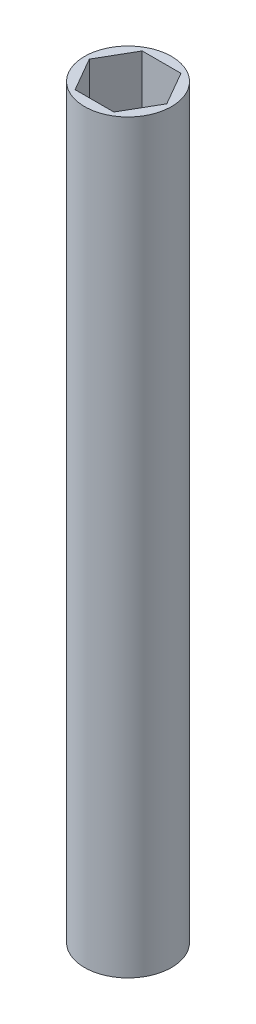
ISO-10303-21;
HEADER;
FILE_DESCRIPTION(('STEP AP214'),'2;1');
FILE_NAME('part.step','',(''),(''),'','','');
FILE_SCHEMA(('AUTOMOTIVE_DESIGN { 1 0 10303 214 1 1 1 1 }'));
ENDSEC;
DATA;
#1=APPLICATION_CONTEXT('core data for automotive mechanical design processes');
#2=APPLICATION_PROTOCOL_DEFINITION('international standard','automotive_design',2000,#1);
#3=PRODUCT_CONTEXT('',#1,'mechanical');
#4=PRODUCT('Part','Part','',(#3));
#5=PRODUCT_RELATED_PRODUCT_CATEGORY('part','',(#4));
#6=PRODUCT_DEFINITION_FORMATION('','',#4);
#7=PRODUCT_DEFINITION_CONTEXT('part definition',#1,'design');
#8=PRODUCT_DEFINITION('design','',#6,#7);
#9=PRODUCT_DEFINITION_SHAPE('','',#8);
#10=(LENGTH_UNIT() NAMED_UNIT(*) SI_UNIT(.MILLI.,.METRE.));
#11=(NAMED_UNIT(*) PLANE_ANGLE_UNIT() SI_UNIT($,.RADIAN.));
#12=(NAMED_UNIT(*) SI_UNIT($,.STERADIAN.) SOLID_ANGLE_UNIT());
#13=UNCERTAINTY_MEASURE_WITH_UNIT(LENGTH_MEASURE(1.E-05),#10,'distance_accuracy_value','');
#14=(GEOMETRIC_REPRESENTATION_CONTEXT(3) GLOBAL_UNCERTAINTY_ASSIGNED_CONTEXT((#13)) GLOBAL_UNIT_ASSIGNED_CONTEXT((#10,
#11,#12)) REPRESENTATION_CONTEXT('',''));
#15=CARTESIAN_POINT('',(0.,0.,0.));
#16=DIRECTION('',(0.,0.,1.));
#17=DIRECTION('',(1.,0.,0.));
#18=AXIS2_PLACEMENT_3D('',#15,#16,#17);
#19=CARTESIAN_POINT('',(0.,152.4,0.));
#20=DIRECTION('',(0.,1.,0.));
#21=DIRECTION('',(0.,0.,1.));
#22=AXIS2_PLACEMENT_3D('',#19,#20,#21);
#23=PLANE('',#22);
#24=CARTESIAN_POINT('',(0.,152.4,0.));
#25=DIRECTION('',(0.,1.,0.));
#26=DIRECTION('',(0.,0.,1.));
#27=AXIS2_PLACEMENT_3D('',#24,#25,#26);
#28=CIRCLE('',#27,8.89);
#29=CARTESIAN_POINT('',(0.,152.4,-8.89));
#30=VERTEX_POINT('',#29);
#31=EDGE_CURVE('E11',#30,#30,#28,.T.);
#32=ORIENTED_EDGE('',*,*,#31,.T.);
#33=EDGE_LOOP('',(#32));
#34=FACE_BOUND('',#33,.T.);
#35=DIRECTION('',(0.5,0.,-0.866025403784439));
#36=VECTOR('',#35,1.);
#37=CARTESIAN_POINT('',(3.95946814610245,152.4,6.858));
#38=LINE('',#37,#36);
#39=CARTESIAN_POINT('',(3.95946814610245,152.4,6.858));
#40=VERTEX_POINT('',#39);
#41=CARTESIAN_POINT('',(7.91893629220491,152.4,0.));
#42=VERTEX_POINT('',#41);
#43=EDGE_CURVE('E98',#40,#42,#38,.T.);
#44=ORIENTED_EDGE('',*,*,#43,.F.);
#45=DIRECTION('',(1.,0.,0.));
#46=VECTOR('',#45,1.);
#47=CARTESIAN_POINT('',(-3.95946814610246,152.4,6.858));
#48=LINE('',#47,#46);
#49=CARTESIAN_POINT('',(-3.95946814610246,152.4,6.858));
#50=VERTEX_POINT('',#49);
#51=EDGE_CURVE('E90',#50,#40,#48,.T.);
#52=ORIENTED_EDGE('',*,*,#51,.F.);
#53=DIRECTION('',(0.5,0.,0.866025403784439));
#54=VECTOR('',#53,1.);
#55=CARTESIAN_POINT('',(-7.91893629220491,152.4,0.));
#56=LINE('',#55,#54);
#57=CARTESIAN_POINT('',(-7.91893629220491,152.4,0.));
#58=VERTEX_POINT('',#57);
#59=EDGE_CURVE('E118',#58,#50,#56,.T.);
#60=ORIENTED_EDGE('',*,*,#59,.F.);
#61=DIRECTION('',(-0.5,0.,0.866025403784439));
#62=VECTOR('',#61,1.);
#63=CARTESIAN_POINT('',(-3.95946814610245,152.4,-6.858));
#64=LINE('',#63,#62);
#65=CARTESIAN_POINT('',(-3.95946814610245,152.4,-6.858));
#66=VERTEX_POINT('',#65);
#67=EDGE_CURVE('E116',#66,#58,#64,.T.);
#68=ORIENTED_EDGE('',*,*,#67,.F.);
#69=DIRECTION('',(-1.,0.,0.));
#70=VECTOR('',#69,1.);
#71=CARTESIAN_POINT('',(3.95946814610245,152.4,-6.858));
#72=LINE('',#71,#70);
#73=CARTESIAN_POINT('',(3.95946814610245,152.4,-6.858));
#74=VERTEX_POINT('',#73);
#75=EDGE_CURVE('E112',#74,#66,#72,.T.);
#76=ORIENTED_EDGE('',*,*,#75,.F.);
#77=DIRECTION('',(-0.5,0.,-0.866025403784439));
#78=VECTOR('',#77,1.);
#79=CARTESIAN_POINT('',(7.91893629220491,152.4,0.));
#80=LINE('',#79,#78);
#81=EDGE_CURVE('E110',#42,#74,#80,.T.);
#82=ORIENTED_EDGE('',*,*,#81,.F.);
#83=EDGE_LOOP('',(#44,#52,#60,#68,#76,#82));
#84=FACE_BOUND('',#83,.T.);
#85=ADVANCED_FACE('F37',(#34,#84),#23,.T.);
#86=CARTESIAN_POINT('',(0.,0.,0.));
#87=DIRECTION('',(0.,1.,0.));
#88=DIRECTION('',(0.,0.,1.));
#89=AXIS2_PLACEMENT_3D('',#86,#87,#88);
#90=PLANE('',#89);
#91=CARTESIAN_POINT('',(0.,0.,0.));
#92=DIRECTION('',(0.,1.,0.));
#93=DIRECTION('',(0.,0.,1.));
#94=AXIS2_PLACEMENT_3D('',#91,#92,#93);
#95=CIRCLE('',#94,8.89);
#96=CARTESIAN_POINT('',(0.,0.,-8.89));
#97=VERTEX_POINT('',#96);
#98=EDGE_CURVE('E41',#97,#97,#95,.T.);
#99=ORIENTED_EDGE('',*,*,#98,.F.);
#100=EDGE_LOOP('',(#99));
#101=FACE_BOUND('',#100,.T.);
#102=DIRECTION('',(1.,0.,0.));
#103=VECTOR('',#102,1.);
#104=CARTESIAN_POINT('',(-3.95946814610246,0.,6.858));
#105=LINE('',#104,#103);
#106=CARTESIAN_POINT('',(-3.95946814610246,0.,6.858));
#107=VERTEX_POINT('',#106);
#108=CARTESIAN_POINT('',(3.95946814610245,0.,6.858));
#109=VERTEX_POINT('',#108);
#110=EDGE_CURVE('E60',#107,#109,#105,.T.);
#111=ORIENTED_EDGE('',*,*,#110,.T.);
#112=DIRECTION('',(0.5,0.,-0.866025403784439));
#113=VECTOR('',#112,1.);
#114=CARTESIAN_POINT('',(3.95946814610245,0.,6.858));
#115=LINE('',#114,#113);
#116=CARTESIAN_POINT('',(7.91893629220491,0.,0.));
#117=VERTEX_POINT('',#116);
#118=EDGE_CURVE('E105',#109,#117,#115,.T.);
#119=ORIENTED_EDGE('',*,*,#118,.T.);
#120=DIRECTION('',(-0.5,0.,-0.866025403784439));
#121=VECTOR('',#120,1.);
#122=CARTESIAN_POINT('',(7.91893629220491,0.,0.));
#123=LINE('',#122,#121);
#124=CARTESIAN_POINT('',(3.95946814610245,0.,-6.858));
#125=VERTEX_POINT('',#124);
#126=EDGE_CURVE('E122',#117,#125,#123,.T.);
#127=ORIENTED_EDGE('',*,*,#126,.T.);
#128=DIRECTION('',(-1.,0.,0.));
#129=VECTOR('',#128,1.);
#130=CARTESIAN_POINT('',(3.95946814610245,0.,-6.858));
#131=LINE('',#130,#129);
#132=CARTESIAN_POINT('',(-3.95946814610245,0.,-6.858));
#133=VERTEX_POINT('',#132);
#134=EDGE_CURVE('E125',#125,#133,#131,.T.);
#135=ORIENTED_EDGE('',*,*,#134,.T.);
#136=DIRECTION('',(-0.5,0.,0.866025403784439));
#137=VECTOR('',#136,1.);
#138=CARTESIAN_POINT('',(-3.95946814610245,0.,-6.858));
#139=LINE('',#138,#137);
#140=CARTESIAN_POINT('',(-7.91893629220491,0.,0.));
#141=VERTEX_POINT('',#140);
#142=EDGE_CURVE('E128',#133,#141,#139,.T.);
#143=ORIENTED_EDGE('',*,*,#142,.T.);
#144=DIRECTION('',(0.5,0.,0.866025403784439));
#145=VECTOR('',#144,1.);
#146=CARTESIAN_POINT('',(-7.91893629220491,0.,0.));
#147=LINE('',#146,#145);
#148=EDGE_CURVE('E99',#141,#107,#147,.T.);
#149=ORIENTED_EDGE('',*,*,#148,.T.);
#150=EDGE_LOOP('',(#111,#119,#127,#135,#143,#149));
#151=FACE_BOUND('',#150,.T.);
#152=ADVANCED_FACE('F145',(#101,#151),#90,.F.);
#153=CARTESIAN_POINT('',(0.,152.4,0.));
#154=DIRECTION('',(0.,-1.,0.));
#155=DIRECTION('',(0.,0.,-1.));
#156=AXIS2_PLACEMENT_3D('',#153,#154,#155);
#157=CYLINDRICAL_SURFACE('',#156,8.89);
#158=CARTESIAN_POINT('',(0.,152.4,-8.89));
#159=CARTESIAN_POINT('',(0.,150.8125,-8.89));
#160=CARTESIAN_POINT('',(0.,149.225,-8.89));
#161=CARTESIAN_POINT('',(0.,146.05,-8.89));
#162=CARTESIAN_POINT('',(0.,144.4625,-8.89));
#163=CARTESIAN_POINT('',(0.,141.2875,-8.89));
#164=CARTESIAN_POINT('',(0.,139.7,-8.89));
#165=CARTESIAN_POINT('',(0.,136.525,-8.89));
#166=CARTESIAN_POINT('',(0.,134.9375,-8.89));
#167=CARTESIAN_POINT('',(0.,131.7625,-8.89));
#168=CARTESIAN_POINT('',(0.,130.175,-8.89));
#169=CARTESIAN_POINT('',(0.,127.,-8.89));
#170=CARTESIAN_POINT('',(0.,125.4125,-8.89));
#171=CARTESIAN_POINT('',(0.,122.2375,-8.89));
#172=CARTESIAN_POINT('',(0.,120.65,-8.89));
#173=CARTESIAN_POINT('',(0.,117.475,-8.89));
#174=CARTESIAN_POINT('',(0.,115.8875,-8.89));
#175=CARTESIAN_POINT('',(0.,112.7125,-8.89));
#176=CARTESIAN_POINT('',(0.,111.125,-8.89));
#177=CARTESIAN_POINT('',(0.,107.95,-8.89));
#178=CARTESIAN_POINT('',(0.,106.3625,-8.89));
#179=CARTESIAN_POINT('',(0.,103.1875,-8.89));
#180=CARTESIAN_POINT('',(0.,101.6,-8.89));
#181=CARTESIAN_POINT('',(0.,98.425,-8.89));
#182=CARTESIAN_POINT('',(0.,96.8375,-8.89));
#183=CARTESIAN_POINT('',(0.,93.6625,-8.89));
#184=CARTESIAN_POINT('',(0.,92.075,-8.89));
#185=CARTESIAN_POINT('',(0.,88.9,-8.89));
#186=CARTESIAN_POINT('',(0.,87.3125,-8.89));
#187=CARTESIAN_POINT('',(0.,84.1375,-8.89));
#188=CARTESIAN_POINT('',(0.,82.55,-8.89));
#189=CARTESIAN_POINT('',(0.,79.375,-8.89));
#190=CARTESIAN_POINT('',(0.,77.7875,-8.89));
#191=CARTESIAN_POINT('',(0.,74.6125,-8.89));
#192=CARTESIAN_POINT('',(0.,73.025,-8.89));
#193=CARTESIAN_POINT('',(0.,69.85,-8.89));
#194=CARTESIAN_POINT('',(0.,68.2625,-8.89));
#195=CARTESIAN_POINT('',(0.,65.0875,-8.89));
#196=CARTESIAN_POINT('',(0.,63.5,-8.89));
#197=CARTESIAN_POINT('',(0.,60.325,-8.89));
#198=CARTESIAN_POINT('',(0.,58.7375,-8.89));
#199=CARTESIAN_POINT('',(0.,55.5625,-8.89));
#200=CARTESIAN_POINT('',(0.,53.975,-8.89));
#201=CARTESIAN_POINT('',(0.,50.8,-8.89));
#202=CARTESIAN_POINT('',(0.,49.2125,-8.89));
#203=CARTESIAN_POINT('',(0.,46.0375,-8.89));
#204=CARTESIAN_POINT('',(0.,44.45,-8.89));
#205=CARTESIAN_POINT('',(0.,41.275,-8.89));
#206=CARTESIAN_POINT('',(0.,39.6875,-8.89));
#207=CARTESIAN_POINT('',(0.,36.5125,-8.89));
#208=CARTESIAN_POINT('',(0.,34.925,-8.89));
#209=CARTESIAN_POINT('',(0.,31.75,-8.89));
#210=CARTESIAN_POINT('',(0.,30.1625,-8.89));
#211=CARTESIAN_POINT('',(0.,26.9875,-8.89));
#212=CARTESIAN_POINT('',(0.,25.4,-8.89));
#213=CARTESIAN_POINT('',(0.,22.225,-8.89));
#214=CARTESIAN_POINT('',(0.,20.6375,-8.89));
#215=CARTESIAN_POINT('',(0.,17.4625,-8.89));
#216=CARTESIAN_POINT('',(0.,15.875,-8.89));
#217=CARTESIAN_POINT('',(0.,12.7,-8.89));
#218=CARTESIAN_POINT('',(0.,11.1125,-8.89));
#219=CARTESIAN_POINT('',(0.,7.93750000000001,-8.89));
#220=CARTESIAN_POINT('',(0.,6.35,-8.89));
#221=CARTESIAN_POINT('',(0.,3.175,-8.89));
#222=CARTESIAN_POINT('',(0.,1.5875,-8.89));
#223=CARTESIAN_POINT('',(0.,0.,-8.89));
#224=B_SPLINE_CURVE_WITH_KNOTS('',3,(#158,#159,#160,#161,#162,#163,#164,#165,#166,#167,#168,
#169,#170,#171,#172,#173,#174,#175,#176,#177,#178,#179,#180,#181,#182,#183,#184,#185,#186,#187,
#188,#189,#190,#191,#192,#193,#194,#195,#196,#197,#198,#199,#200,#201,#202,#203,#204,#205,#206,
#207,#208,#209,#210,#211,#212,#213,#214,#215,#216,#217,#218,#219,#220,#221,#222,#223),
.UNSPECIFIED.,.F.,.F.,(4,2,2,2,2,2,2,2,2,2,2,2,2,2,2,2,2,2,2,2,2,2,2,2,2,2,2,2,2,2,2,2,4),(0.,
4.7625,9.52500000000001,14.2875,19.05,23.8125,28.575,33.3375,38.1,42.8625,47.625,52.3875,57.15,
61.9125,66.675,71.4375,76.2,80.9625,85.725,90.4875,95.25,100.0125,104.775,109.5375,114.3,
119.0625,123.825,128.5875,133.35,138.1125,142.875,147.6375,152.4),.UNSPECIFIED.);
#225=EDGE_CURVE('BSEAM39',#30,#97,#224,.T.);
#226=ORIENTED_EDGE('',*,*,#31,.F.);
#227=ORIENTED_EDGE('',*,*,#98,.T.);
#228=ORIENTED_EDGE('',*,*,#225,.T.);
#229=ORIENTED_EDGE('',*,*,#225,.F.);
#230=EDGE_LOOP('',(#226,#228,#227,#229));
#231=FACE_BOUND('',#230,.T.);
#232=ADVANCED_FACE('F39',(#231),#157,.T.);
#233=CARTESIAN_POINT('',(-3.95946814610246,152.4,6.858));
#234=DIRECTION('',(0.,0.,-1.));
#235=DIRECTION('',(-1.,0.,0.));
#236=AXIS2_PLACEMENT_3D('',#233,#234,#235);
#237=PLANE('',#236);
#238=ORIENTED_EDGE('',*,*,#110,.F.);
#239=DIRECTION('',(0.,-1.,0.));
#240=VECTOR('',#239,1.);
#241=CARTESIAN_POINT('',(-3.95946814610246,152.4,6.858));
#242=LINE('',#241,#240);
#243=EDGE_CURVE('E94',#50,#107,#242,.T.);
#244=ORIENTED_EDGE('',*,*,#243,.F.);
#245=ORIENTED_EDGE('',*,*,#51,.T.);
#246=DIRECTION('',(0.,-1.,0.));
#247=VECTOR('',#246,1.);
#248=CARTESIAN_POINT('',(3.95946814610245,152.4,6.858));
#249=LINE('',#248,#247);
#250=EDGE_CURVE('E93',#40,#109,#249,.T.);
#251=ORIENTED_EDGE('',*,*,#250,.T.);
#252=EDGE_LOOP('',(#238,#244,#245,#251));
#253=FACE_BOUND('',#252,.T.);
#254=ADVANCED_FACE('F92',(#253),#237,.T.);
#255=CARTESIAN_POINT('',(3.95946814610245,152.4,6.858));
#256=DIRECTION('',(-0.866025403784439,0.,-0.5));
#257=DIRECTION('',(-0.5,0.,0.866025403784438));
#258=AXIS2_PLACEMENT_3D('',#255,#256,#257);
#259=PLANE('',#258);
#260=ORIENTED_EDGE('',*,*,#118,.F.);
#261=ORIENTED_EDGE('',*,*,#250,.F.);
#262=ORIENTED_EDGE('',*,*,#43,.T.);
#263=DIRECTION('',(0.,-1.,0.));
#264=VECTOR('',#263,1.);
#265=CARTESIAN_POINT('',(7.91893629220491,152.4,0.));
#266=LINE('',#265,#264);
#267=EDGE_CURVE('E106',#42,#117,#266,.T.);
#268=ORIENTED_EDGE('',*,*,#267,.T.);
#269=EDGE_LOOP('',(#260,#261,#262,#268));
#270=FACE_BOUND('',#269,.T.);
#271=ADVANCED_FACE('F102',(#270),#259,.T.);
#272=CARTESIAN_POINT('',(7.91893629220491,152.4,0.));
#273=DIRECTION('',(-0.866025403784439,0.,0.5));
#274=DIRECTION('',(0.5,0.,0.866025403784439));
#275=AXIS2_PLACEMENT_3D('',#272,#273,#274);
#276=PLANE('',#275);
#277=ORIENTED_EDGE('',*,*,#126,.F.);
#278=ORIENTED_EDGE('',*,*,#267,.F.);
#279=ORIENTED_EDGE('',*,*,#81,.T.);
#280=DIRECTION('',(0.,-1.,0.));
#281=VECTOR('',#280,1.);
#282=CARTESIAN_POINT('',(3.95946814610245,152.4,-6.858));
#283=LINE('',#282,#281);
#284=EDGE_CURVE('E137',#74,#125,#283,.T.);
#285=ORIENTED_EDGE('',*,*,#284,.T.);
#286=EDGE_LOOP('',(#277,#278,#279,#285));
#287=FACE_BOUND('',#286,.T.);
#288=ADVANCED_FACE('F141',(#287),#276,.T.);
#289=CARTESIAN_POINT('',(3.95946814610245,152.4,-6.858));
#290=DIRECTION('',(0.,0.,1.));
#291=DIRECTION('',(1.,0.,0.));
#292=AXIS2_PLACEMENT_3D('',#289,#290,#291);
#293=PLANE('',#292);
#294=ORIENTED_EDGE('',*,*,#134,.F.);
#295=ORIENTED_EDGE('',*,*,#284,.F.);
#296=ORIENTED_EDGE('',*,*,#75,.T.);
#297=DIRECTION('',(0.,-1.,0.));
#298=VECTOR('',#297,1.);
#299=CARTESIAN_POINT('',(-3.95946814610245,152.4,-6.858));
#300=LINE('',#299,#298);
#301=EDGE_CURVE('E135',#66,#133,#300,.T.);
#302=ORIENTED_EDGE('',*,*,#301,.T.);
#303=EDGE_LOOP('',(#294,#295,#296,#302));
#304=FACE_BOUND('',#303,.T.);
#305=ADVANCED_FACE('F153',(#304),#293,.T.);
#306=CARTESIAN_POINT('',(-3.95946814610245,152.4,-6.858));
#307=DIRECTION('',(0.866025403784439,0.,0.5));
#308=DIRECTION('',(0.5,0.,-0.866025403784438));
#309=AXIS2_PLACEMENT_3D('',#306,#307,#308);
#310=PLANE('',#309);
#311=ORIENTED_EDGE('',*,*,#142,.F.);
#312=ORIENTED_EDGE('',*,*,#301,.F.);
#313=ORIENTED_EDGE('',*,*,#67,.T.);
#314=DIRECTION('',(0.,-1.,0.));
#315=VECTOR('',#314,1.);
#316=CARTESIAN_POINT('',(-7.91893629220491,152.4,0.));
#317=LINE('',#316,#315);
#318=EDGE_CURVE('E52',#58,#141,#317,.T.);
#319=ORIENTED_EDGE('',*,*,#318,.T.);
#320=EDGE_LOOP('',(#311,#312,#313,#319));
#321=FACE_BOUND('',#320,.T.);
#322=ADVANCED_FACE('F151',(#321),#310,.T.);
#323=CARTESIAN_POINT('',(-7.91893629220491,152.4,0.));
#324=DIRECTION('',(0.866025403784439,0.,-0.5));
#325=DIRECTION('',(-0.5,0.,-0.866025403784439));
#326=AXIS2_PLACEMENT_3D('',#323,#324,#325);
#327=PLANE('',#326);
#328=ORIENTED_EDGE('',*,*,#148,.F.);
#329=ORIENTED_EDGE('',*,*,#318,.F.);
#330=ORIENTED_EDGE('',*,*,#59,.T.);
#331=ORIENTED_EDGE('',*,*,#243,.T.);
#332=EDGE_LOOP('',(#328,#329,#330,#331));
#333=FACE_BOUND('',#332,.T.);
#334=ADVANCED_FACE('F147',(#333),#327,.T.);
#335=CLOSED_SHELL('',(#85,#152,#232,#254,#271,#288,#305,#322,#334));
#336=MANIFOLD_SOLID_BREP('B2',#335);
#337=ADVANCED_BREP_SHAPE_REPRESENTATION('',(#18,#336),#14);
#338=SHAPE_DEFINITION_REPRESENTATION(#9,#337);
ENDSEC;
END-ISO-10303-21;
